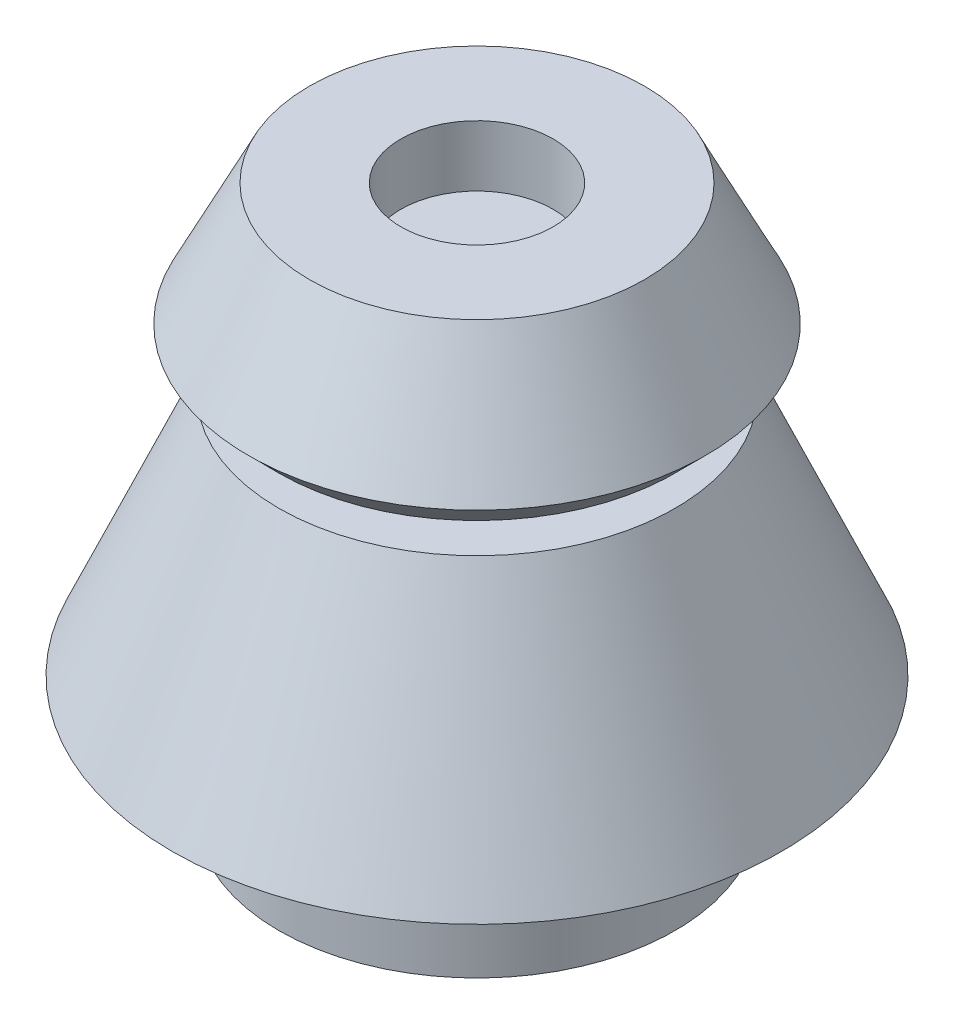
ISO-10303-21;
HEADER;
FILE_DESCRIPTION(('STEP AP214'),'2;1');
FILE_NAME('part.step','',(''),(''),'','','');
FILE_SCHEMA(('AUTOMOTIVE_DESIGN { 1 0 10303 214 1 1 1 1 }'));
ENDSEC;
DATA;
#1=APPLICATION_CONTEXT('core data for automotive mechanical design processes');
#2=APPLICATION_PROTOCOL_DEFINITION('international standard','automotive_design',2000,#1);
#3=PRODUCT_CONTEXT('',#1,'mechanical');
#4=PRODUCT('Part','Part','',(#3));
#5=PRODUCT_RELATED_PRODUCT_CATEGORY('part','',(#4));
#6=PRODUCT_DEFINITION_FORMATION('','',#4);
#7=PRODUCT_DEFINITION_CONTEXT('part definition',#1,'design');
#8=PRODUCT_DEFINITION('design','',#6,#7);
#9=PRODUCT_DEFINITION_SHAPE('','',#8);
#10=(LENGTH_UNIT() NAMED_UNIT(*) SI_UNIT(.MILLI.,.METRE.));
#11=(NAMED_UNIT(*) PLANE_ANGLE_UNIT() SI_UNIT($,.RADIAN.));
#12=(NAMED_UNIT(*) SI_UNIT($,.STERADIAN.) SOLID_ANGLE_UNIT());
#13=UNCERTAINTY_MEASURE_WITH_UNIT(LENGTH_MEASURE(1.E-05),#10,'distance_accuracy_value','');
#14=(GEOMETRIC_REPRESENTATION_CONTEXT(3) GLOBAL_UNCERTAINTY_ASSIGNED_CONTEXT((#13)) GLOBAL_UNIT_ASSIGNED_CONTEXT((#10,
#11,#12)) REPRESENTATION_CONTEXT('',''));
#15=CARTESIAN_POINT('',(0.,0.,0.));
#16=DIRECTION('',(0.,0.,1.));
#17=DIRECTION('',(1.,0.,0.));
#18=AXIS2_PLACEMENT_3D('',#15,#16,#17);
#19=CARTESIAN_POINT('',(0.,0.,0.));
#20=DIRECTION('',(0.,-1.,0.));
#21=DIRECTION('',(0.,0.,-1.));
#22=AXIS2_PLACEMENT_3D('',#19,#20,#21);
#23=PLANE('',#22);
#24=CARTESIAN_POINT('',(0.,0.,0.));
#25=DIRECTION('',(0.,-1.,0.));
#26=DIRECTION('',(0.,0.,-1.));
#27=AXIS2_PLACEMENT_3D('',#24,#25,#26);
#28=CIRCLE('',#27,2.5);
#29=CARTESIAN_POINT('',(0.,0.,-2.5));
#30=VERTEX_POINT('',#29);
#31=EDGE_CURVE('E10',#30,#30,#28,.T.);
#32=ORIENTED_EDGE('',*,*,#31,.F.);
#33=EDGE_LOOP('',(#32));
#34=FACE_BOUND('',#33,.T.);
#35=ADVANCED_FACE('F31',(#34),#23,.F.);
#36=CARTESIAN_POINT('',(0.,0.,0.));
#37=DIRECTION('',(0.,-1.,0.));
#38=DIRECTION('',(0.,0.,-1.));
#39=AXIS2_PLACEMENT_3D('',#36,#37,#38);
#40=CYLINDRICAL_SURFACE('',#39,2.5);
#41=CARTESIAN_POINT('',(0.,2.,0.));
#42=DIRECTION('',(0.,-1.,0.));
#43=DIRECTION('',(0.,0.,-1.));
#44=AXIS2_PLACEMENT_3D('',#41,#42,#43);
#45=CIRCLE('',#44,2.5);
#46=CARTESIAN_POINT('',(0.,2.,-2.5));
#47=VERTEX_POINT('',#46);
#48=EDGE_CURVE('E37',#47,#47,#45,.T.);
#49=ORIENTED_EDGE('',*,*,#48,.F.);
#50=EDGE_LOOP('',(#49));
#51=FACE_BOUND('',#50,.T.);
#52=ORIENTED_EDGE('',*,*,#31,.T.);
#53=EDGE_LOOP('',(#52));
#54=FACE_BOUND('',#53,.T.);
#55=ADVANCED_FACE('F124',(#51,#54),#40,.F.);
#56=CARTESIAN_POINT('',(-2.5,2.,0.));
#57=DIRECTION('',(0.,-1.,0.));
#58=DIRECTION('',(0.,0.,-1.));
#59=AXIS2_PLACEMENT_3D('',#56,#57,#58);
#60=PLANE('',#59);
#61=CARTESIAN_POINT('',(0.,2.,0.));
#62=DIRECTION('',(0.,-1.,0.));
#63=DIRECTION('',(0.,0.,-1.));
#64=AXIS2_PLACEMENT_3D('',#61,#62,#63);
#65=CIRCLE('',#64,5.5);
#66=CARTESIAN_POINT('',(0.,2.,-5.5));
#67=VERTEX_POINT('',#66);
#68=EDGE_CURVE('E41',#67,#67,#65,.T.);
#69=ORIENTED_EDGE('',*,*,#68,.F.);
#70=EDGE_LOOP('',(#69));
#71=FACE_BOUND('',#70,.T.);
#72=ORIENTED_EDGE('',*,*,#48,.T.);
#73=EDGE_LOOP('',(#72));
#74=FACE_BOUND('',#73,.T.);
#75=ADVANCED_FACE('F119',(#71,#74),#60,.F.);
#76=CARTESIAN_POINT('',(0.,2.,0.));
#77=DIRECTION('',(0.,-1.,0.));
#78=DIRECTION('',(0.,0.,-1.));
#79=AXIS2_PLACEMENT_3D('',#76,#77,#78);
#80=CONICAL_SURFACE('',#79,5.5,0.463647609000806);
#81=CARTESIAN_POINT('',(0.,-2.,0.));
#82=DIRECTION('',(0.,-1.,0.));
#83=DIRECTION('',(0.,0.,-1.));
#84=AXIS2_PLACEMENT_3D('',#81,#82,#83);
#85=CIRCLE('',#84,7.5);
#86=CARTESIAN_POINT('',(0.,-2.,-7.5));
#87=VERTEX_POINT('',#86);
#88=EDGE_CURVE('E45',#87,#87,#85,.T.);
#89=ORIENTED_EDGE('',*,*,#88,.F.);
#90=EDGE_LOOP('',(#89));
#91=FACE_BOUND('',#90,.T.);
#92=ORIENTED_EDGE('',*,*,#68,.T.);
#93=EDGE_LOOP('',(#92));
#94=FACE_BOUND('',#93,.T.);
#95=ADVANCED_FACE('F113',(#91,#94),#80,.T.);
#96=CARTESIAN_POINT('',(0.,-2.,0.));
#97=DIRECTION('',(0.,1.,0.));
#98=DIRECTION('',(0.,0.,1.));
#99=AXIS2_PLACEMENT_3D('',#96,#97,#98);
#100=CONICAL_SURFACE('',#99,7.5,0.785398163397448);
#101=CARTESIAN_POINT('',(0.,-3.,0.));
#102=DIRECTION('',(0.,-1.,0.));
#103=DIRECTION('',(0.,0.,-1.));
#104=AXIS2_PLACEMENT_3D('',#101,#102,#103);
#105=CIRCLE('',#104,6.5);
#106=CARTESIAN_POINT('',(0.,-3.,-6.5));
#107=VERTEX_POINT('',#106);
#108=EDGE_CURVE('E50',#107,#107,#105,.T.);
#109=ORIENTED_EDGE('',*,*,#108,.F.);
#110=EDGE_LOOP('',(#109));
#111=FACE_BOUND('',#110,.T.);
#112=ORIENTED_EDGE('',*,*,#88,.T.);
#113=EDGE_LOOP('',(#112));
#114=FACE_BOUND('',#113,.T.);
#115=ADVANCED_FACE('F107',(#111,#114),#100,.T.);
#116=CARTESIAN_POINT('',(-6.5,-3.,0.));
#117=DIRECTION('',(0.,1.,0.));
#118=DIRECTION('',(0.,0.,1.));
#119=AXIS2_PLACEMENT_3D('',#116,#117,#118);
#120=PLANE('',#119);
#121=CARTESIAN_POINT('',(0.,-3.,0.));
#122=DIRECTION('',(0.,-1.,0.));
#123=DIRECTION('',(0.,0.,-1.));
#124=AXIS2_PLACEMENT_3D('',#121,#122,#123);
#125=CIRCLE('',#124,1.5);
#126=CARTESIAN_POINT('',(0.,-3.,-1.5));
#127=VERTEX_POINT('',#126);
#128=EDGE_CURVE('E53',#127,#127,#125,.T.);
#129=ORIENTED_EDGE('',*,*,#128,.F.);
#130=EDGE_LOOP('',(#129));
#131=FACE_BOUND('',#130,.T.);
#132=ORIENTED_EDGE('',*,*,#108,.T.);
#133=EDGE_LOOP('',(#132));
#134=FACE_BOUND('',#133,.T.);
#135=ADVANCED_FACE('F101',(#131,#134),#120,.F.);
#136=CARTESIAN_POINT('',(0.,0.,0.));
#137=DIRECTION('',(0.,-1.,0.));
#138=DIRECTION('',(0.,0.,-1.));
#139=AXIS2_PLACEMENT_3D('',#136,#137,#138);
#140=CYLINDRICAL_SURFACE('',#139,1.5);
#141=CARTESIAN_POINT('',(0.,-4.,0.));
#142=DIRECTION('',(0.,-1.,0.));
#143=DIRECTION('',(0.,0.,-1.));
#144=AXIS2_PLACEMENT_3D('',#141,#142,#143);
#145=CIRCLE('',#144,1.5);
#146=CARTESIAN_POINT('',(0.,-4.,-1.5));
#147=VERTEX_POINT('',#146);
#148=EDGE_CURVE('E56',#147,#147,#145,.T.);
#149=ORIENTED_EDGE('',*,*,#148,.F.);
#150=EDGE_LOOP('',(#149));
#151=FACE_BOUND('',#150,.T.);
#152=ORIENTED_EDGE('',*,*,#128,.T.);
#153=EDGE_LOOP('',(#152));
#154=FACE_BOUND('',#153,.T.);
#155=ADVANCED_FACE('F95',(#151,#154),#140,.T.);
#156=CARTESIAN_POINT('',(-1.5,-4.,0.));
#157=DIRECTION('',(0.,-1.,0.));
#158=DIRECTION('',(0.,0.,-1.));
#159=AXIS2_PLACEMENT_3D('',#156,#157,#158);
#160=PLANE('',#159);
#161=CARTESIAN_POINT('',(0.,-4.,0.));
#162=DIRECTION('',(0.,-1.,0.));
#163=DIRECTION('',(0.,0.,-1.));
#164=AXIS2_PLACEMENT_3D('',#161,#162,#163);
#165=CIRCLE('',#164,6.5);
#166=CARTESIAN_POINT('',(0.,-4.,-6.5));
#167=VERTEX_POINT('',#166);
#168=EDGE_CURVE('E59',#167,#167,#165,.T.);
#169=ORIENTED_EDGE('',*,*,#168,.F.);
#170=EDGE_LOOP('',(#169));
#171=FACE_BOUND('',#170,.T.);
#172=ORIENTED_EDGE('',*,*,#148,.T.);
#173=EDGE_LOOP('',(#172));
#174=FACE_BOUND('',#173,.T.);
#175=ADVANCED_FACE('F89',(#171,#174),#160,.F.);
#176=CARTESIAN_POINT('',(0.,-4.,0.));
#177=DIRECTION('',(0.,-1.,0.));
#178=DIRECTION('',(0.,0.,-1.));
#179=AXIS2_PLACEMENT_3D('',#176,#177,#178);
#180=CONICAL_SURFACE('',#179,6.5,0.412410441597387);
#181=CARTESIAN_POINT('',(0.,-12.,0.));
#182=DIRECTION('',(0.,-1.,0.));
#183=DIRECTION('',(0.,0.,-1.));
#184=AXIS2_PLACEMENT_3D('',#181,#182,#183);
#185=CIRCLE('',#184,10.);
#186=CARTESIAN_POINT('',(0.,-12.,-10.));
#187=VERTEX_POINT('',#186);
#188=EDGE_CURVE('E62',#187,#187,#185,.T.);
#189=ORIENTED_EDGE('',*,*,#188,.F.);
#190=EDGE_LOOP('',(#189));
#191=FACE_BOUND('',#190,.T.);
#192=ORIENTED_EDGE('',*,*,#168,.T.);
#193=EDGE_LOOP('',(#192));
#194=FACE_BOUND('',#193,.T.);
#195=ADVANCED_FACE('F83',(#191,#194),#180,.T.);
#196=CARTESIAN_POINT('',(-10.,-12.,0.));
#197=DIRECTION('',(0.,1.,0.));
#198=DIRECTION('',(0.,0.,1.));
#199=AXIS2_PLACEMENT_3D('',#196,#197,#198);
#200=PLANE('',#199);
#201=CARTESIAN_POINT('',(0.,-12.,0.));
#202=DIRECTION('',(0.,-1.,0.));
#203=DIRECTION('',(0.,0.,-1.));
#204=AXIS2_PLACEMENT_3D('',#201,#202,#203);
#205=CIRCLE('',#204,6.5);
#206=CARTESIAN_POINT('',(0.,-12.,-6.5));
#207=VERTEX_POINT('',#206);
#208=EDGE_CURVE('E65',#207,#207,#205,.T.);
#209=ORIENTED_EDGE('',*,*,#208,.F.);
#210=EDGE_LOOP('',(#209));
#211=FACE_BOUND('',#210,.T.);
#212=ORIENTED_EDGE('',*,*,#188,.T.);
#213=EDGE_LOOP('',(#212));
#214=FACE_BOUND('',#213,.T.);
#215=ADVANCED_FACE('F77',(#211,#214),#200,.F.);
#216=CARTESIAN_POINT('',(0.,0.,0.));
#217=DIRECTION('',(0.,-1.,0.));
#218=DIRECTION('',(0.,0.,-1.));
#219=AXIS2_PLACEMENT_3D('',#216,#217,#218);
#220=CYLINDRICAL_SURFACE('',#219,6.5);
#221=CARTESIAN_POINT('',(0.,-16.,0.));
#222=DIRECTION('',(0.,-1.,0.));
#223=DIRECTION('',(0.,0.,-1.));
#224=AXIS2_PLACEMENT_3D('',#221,#222,#223);
#225=CIRCLE('',#224,6.5);
#226=CARTESIAN_POINT('',(0.,-16.,-6.5));
#227=VERTEX_POINT('',#226);
#228=EDGE_CURVE('E68',#227,#227,#225,.T.);
#229=ORIENTED_EDGE('',*,*,#228,.F.);
#230=EDGE_LOOP('',(#229));
#231=FACE_BOUND('',#230,.T.);
#232=ORIENTED_EDGE('',*,*,#208,.T.);
#233=EDGE_LOOP('',(#232));
#234=FACE_BOUND('',#233,.T.);
#235=ADVANCED_FACE('F74',(#231,#234),#220,.T.);
#236=CARTESIAN_POINT('',(-6.5,-16.,0.));
#237=DIRECTION('',(0.,1.,0.));
#238=DIRECTION('',(0.,0.,1.));
#239=AXIS2_PLACEMENT_3D('',#236,#237,#238);
#240=PLANE('',#239);
#241=ORIENTED_EDGE('',*,*,#228,.T.);
#242=EDGE_LOOP('',(#241));
#243=FACE_BOUND('',#242,.T.);
#244=ADVANCED_FACE('F72',(#243),#240,.F.);
#245=CLOSED_SHELL('',(#35,#55,#75,#95,#115,#135,#155,#175,#195,#215,#235,#244));
#246=MANIFOLD_SOLID_BREP('B2',#245);
#247=ADVANCED_BREP_SHAPE_REPRESENTATION('',(#18,#246),#14);
#248=SHAPE_DEFINITION_REPRESENTATION(#9,#247);
ENDSEC;
END-ISO-10303-21;
